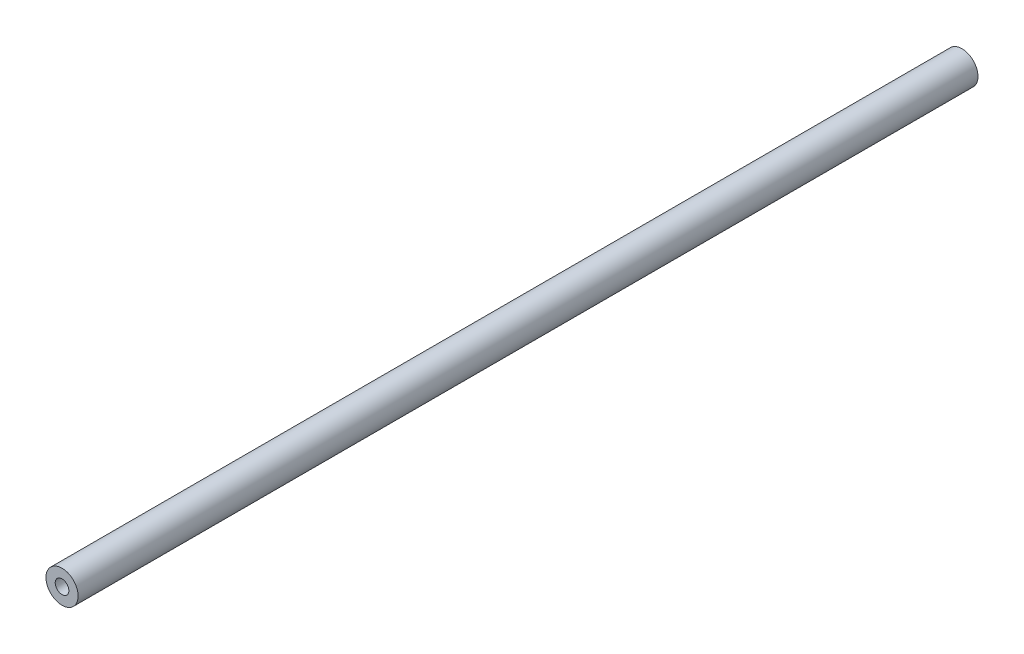
ISO-10303-21;
HEADER;
FILE_DESCRIPTION(('STEP AP214'),'2;1');
FILE_NAME('part.step','',(''),(''),'','','');
FILE_SCHEMA(('AUTOMOTIVE_DESIGN { 1 0 10303 214 1 1 1 1 }'));
ENDSEC;
DATA;
#1=APPLICATION_CONTEXT('core data for automotive mechanical design processes');
#2=APPLICATION_PROTOCOL_DEFINITION('international standard','automotive_design',2000,#1);
#3=PRODUCT_CONTEXT('',#1,'mechanical');
#4=PRODUCT('Part','Part','',(#3));
#5=PRODUCT_RELATED_PRODUCT_CATEGORY('part','',(#4));
#6=PRODUCT_DEFINITION_FORMATION('','',#4);
#7=PRODUCT_DEFINITION_CONTEXT('part definition',#1,'design');
#8=PRODUCT_DEFINITION('design','',#6,#7);
#9=PRODUCT_DEFINITION_SHAPE('','',#8);
#10=(LENGTH_UNIT() NAMED_UNIT(*) SI_UNIT(.MILLI.,.METRE.));
#11=(NAMED_UNIT(*) PLANE_ANGLE_UNIT() SI_UNIT($,.RADIAN.));
#12=(NAMED_UNIT(*) SI_UNIT($,.STERADIAN.) SOLID_ANGLE_UNIT());
#13=UNCERTAINTY_MEASURE_WITH_UNIT(LENGTH_MEASURE(1.E-05),#10,'distance_accuracy_value','');
#14=(GEOMETRIC_REPRESENTATION_CONTEXT(3) GLOBAL_UNCERTAINTY_ASSIGNED_CONTEXT((#13)) GLOBAL_UNIT_ASSIGNED_CONTEXT((#10,
#11,#12)) REPRESENTATION_CONTEXT('',''));
#15=CARTESIAN_POINT('',(0.,0.,0.));
#16=DIRECTION('',(0.,0.,1.));
#17=DIRECTION('',(1.,0.,0.));
#18=AXIS2_PLACEMENT_3D('',#15,#16,#17);
#19=CARTESIAN_POINT('',(0.,0.,133.35));
#20=DIRECTION('',(0.,0.,-1.));
#21=DIRECTION('',(-1.,0.,0.));
#22=AXIS2_PLACEMENT_3D('',#19,#20,#21);
#23=CYLINDRICAL_SURFACE('',#22,4.7625);
#24=CARTESIAN_POINT('',(0.,0.,133.35));
#25=DIRECTION('',(0.,0.,1.));
#26=DIRECTION('',(1.,0.,0.));
#27=AXIS2_PLACEMENT_3D('',#24,#25,#26);
#28=CIRCLE('',#27,4.7625);
#29=CARTESIAN_POINT('',(4.7625,0.,133.35));
#30=VERTEX_POINT('',#29);
#31=EDGE_CURVE('E11',#30,#30,#28,.T.);
#32=ORIENTED_EDGE('',*,*,#31,.F.);
#33=EDGE_LOOP('',(#32));
#34=FACE_BOUND('',#33,.T.);
#35=CARTESIAN_POINT('',(0.,0.,-133.35));
#36=DIRECTION('',(0.,0.,1.));
#37=DIRECTION('',(1.,0.,0.));
#38=AXIS2_PLACEMENT_3D('',#35,#36,#37);
#39=CIRCLE('',#38,4.7625);
#40=CARTESIAN_POINT('',(4.7625,0.,-133.35));
#41=VERTEX_POINT('',#40);
#42=EDGE_CURVE('E60',#41,#41,#39,.T.);
#43=ORIENTED_EDGE('',*,*,#42,.T.);
#44=EDGE_LOOP('',(#43));
#45=FACE_BOUND('',#44,.T.);
#46=ADVANCED_FACE('F57',(#34,#45),#23,.T.);
#47=CARTESIAN_POINT('',(0.,0.,133.35));
#48=DIRECTION('',(0.,0.,1.));
#49=DIRECTION('',(1.,0.,0.));
#50=AXIS2_PLACEMENT_3D('',#47,#48,#49);
#51=PLANE('',#50);
#52=CARTESIAN_POINT('',(0.,0.,133.35));
#53=DIRECTION('',(0.,0.,1.));
#54=DIRECTION('',(1.,0.,0.));
#55=AXIS2_PLACEMENT_3D('',#52,#53,#54);
#56=CIRCLE('',#55,2.01929999999999);
#57=CARTESIAN_POINT('',(2.01929999999999,0.,133.35));
#58=VERTEX_POINT('',#57);
#59=EDGE_CURVE('E83',#58,#58,#56,.T.);
#60=ORIENTED_EDGE('',*,*,#59,.F.);
#61=EDGE_LOOP('',(#60));
#62=FACE_BOUND('',#61,.T.);
#63=ORIENTED_EDGE('',*,*,#31,.T.);
#64=EDGE_LOOP('',(#63));
#65=FACE_BOUND('',#64,.T.);
#66=ADVANCED_FACE('F111',(#62,#65),#51,.T.);
#67=CARTESIAN_POINT('',(0.,0.,-133.35));
#68=DIRECTION('',(0.,0.,1.));
#69=DIRECTION('',(1.,0.,0.));
#70=AXIS2_PLACEMENT_3D('',#67,#68,#69);
#71=PLANE('',#70);
#72=CARTESIAN_POINT('',(0.,0.,-133.35));
#73=DIRECTION('',(0.,0.,-1.));
#74=DIRECTION('',(-1.,0.,0.));
#75=AXIS2_PLACEMENT_3D('',#72,#73,#74);
#76=CIRCLE('',#75,2.01929999999999);
#77=CARTESIAN_POINT('',(-2.01929999999999,0.,-133.35));
#78=VERTEX_POINT('',#77);
#79=EDGE_CURVE('E82',#78,#78,#76,.T.);
#80=ORIENTED_EDGE('',*,*,#79,.F.);
#81=EDGE_LOOP('',(#80));
#82=FACE_BOUND('',#81,.T.);
#83=ORIENTED_EDGE('',*,*,#42,.F.);
#84=EDGE_LOOP('',(#83));
#85=FACE_BOUND('',#84,.T.);
#86=ADVANCED_FACE('F108',(#82,#85),#71,.F.);
#87=CARTESIAN_POINT('',(0.,0.,-121.32056));
#88=DIRECTION('',(0.,0.,-1.));
#89=DIRECTION('',(-1.,0.,0.));
#90=AXIS2_PLACEMENT_3D('',#87,#88,#89);
#91=CONICAL_SURFACE('',#90,2.01929999999999,1.02974425867665);
#92=CARTESIAN_POINT('',(0.,0.,-120.107242151998));
#93=VERTEX_POINT('',#92);
#94=VERTEX_LOOP('',#93);
#95=FACE_BOUND('',#94,.T.);
#96=CARTESIAN_POINT('',(0.,0.,-121.32056));
#97=DIRECTION('',(0.,0.,-1.));
#98=DIRECTION('',(-1.,0.,0.));
#99=AXIS2_PLACEMENT_3D('',#96,#97,#98);
#100=CIRCLE('',#99,2.01929999999999);
#101=CARTESIAN_POINT('',(-2.01929999999999,0.,-121.32056));
#102=VERTEX_POINT('',#101);
#103=EDGE_CURVE('E90',#102,#102,#100,.T.);
#104=ORIENTED_EDGE('',*,*,#103,.T.);
#105=EDGE_LOOP('',(#104));
#106=FACE_BOUND('',#105,.T.);
#107=ADVANCED_FACE('F110',(#95,#106),#91,.F.);
#108=CARTESIAN_POINT('',(0.,0.,-133.35));
#109=DIRECTION('',(0.,0.,-1.));
#110=DIRECTION('',(-1.,0.,0.));
#111=AXIS2_PLACEMENT_3D('',#108,#109,#110);
#112=CYLINDRICAL_SURFACE('',#111,2.01929999999999);
#113=ORIENTED_EDGE('',*,*,#103,.F.);
#114=EDGE_LOOP('',(#113));
#115=FACE_BOUND('',#114,.T.);
#116=ORIENTED_EDGE('',*,*,#79,.T.);
#117=EDGE_LOOP('',(#116));
#118=FACE_BOUND('',#117,.T.);
#119=ADVANCED_FACE('F75',(#115,#118),#112,.F.);
#120=CARTESIAN_POINT('',(0.,0.,121.32056));
#121=DIRECTION('',(0.,0.,1.));
#122=DIRECTION('',(1.,0.,0.));
#123=AXIS2_PLACEMENT_3D('',#120,#121,#122);
#124=CONICAL_SURFACE('',#123,2.01929999999999,1.02974425867665);
#125=CARTESIAN_POINT('',(0.,0.,120.107242151998));
#126=VERTEX_POINT('',#125);
#127=VERTEX_LOOP('',#126);
#128=FACE_BOUND('',#127,.T.);
#129=CARTESIAN_POINT('',(0.,0.,121.32056));
#130=DIRECTION('',(0.,0.,1.));
#131=DIRECTION('',(1.,0.,0.));
#132=AXIS2_PLACEMENT_3D('',#129,#130,#131);
#133=CIRCLE('',#132,2.01929999999999);
#134=CARTESIAN_POINT('',(2.01929999999999,0.,121.32056));
#135=VERTEX_POINT('',#134);
#136=EDGE_CURVE('E79',#135,#135,#133,.T.);
#137=ORIENTED_EDGE('',*,*,#136,.T.);
#138=EDGE_LOOP('',(#137));
#139=FACE_BOUND('',#138,.T.);
#140=ADVANCED_FACE('F71',(#128,#139),#124,.F.);
#141=CARTESIAN_POINT('',(0.,0.,133.35));
#142=DIRECTION('',(0.,0.,1.));
#143=DIRECTION('',(1.,0.,0.));
#144=AXIS2_PLACEMENT_3D('',#141,#142,#143);
#145=CYLINDRICAL_SURFACE('',#144,2.01929999999999);
#146=ORIENTED_EDGE('',*,*,#136,.F.);
#147=EDGE_LOOP('',(#146));
#148=FACE_BOUND('',#147,.T.);
#149=ORIENTED_EDGE('',*,*,#59,.T.);
#150=EDGE_LOOP('',(#149));
#151=FACE_BOUND('',#150,.T.);
#152=ADVANCED_FACE('F74',(#148,#151),#145,.F.);
#153=CLOSED_SHELL('',(#46,#66,#86,#107,#119,#140,#152));
#154=MANIFOLD_SOLID_BREP('B2',#153);
#155=ADVANCED_BREP_SHAPE_REPRESENTATION('',(#18,#154),#14);
#156=SHAPE_DEFINITION_REPRESENTATION(#9,#155);
ENDSEC;
END-ISO-10303-21;
